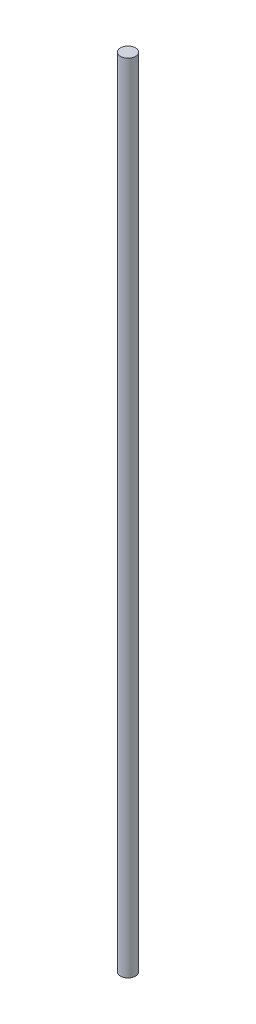
ISO-10303-21;
HEADER;
FILE_DESCRIPTION(('STEP AP214'),'2;1');
FILE_NAME('part.step','',(''),(''),'','','');
FILE_SCHEMA(('AUTOMOTIVE_DESIGN { 1 0 10303 214 1 1 1 1 }'));
ENDSEC;
DATA;
#1=APPLICATION_CONTEXT('core data for automotive mechanical design processes');
#2=APPLICATION_PROTOCOL_DEFINITION('international standard','automotive_design',2000,#1);
#3=PRODUCT_CONTEXT('',#1,'mechanical');
#4=PRODUCT('Part','Part','',(#3));
#5=PRODUCT_RELATED_PRODUCT_CATEGORY('part','',(#4));
#6=PRODUCT_DEFINITION_FORMATION('','',#4);
#7=PRODUCT_DEFINITION_CONTEXT('part definition',#1,'design');
#8=PRODUCT_DEFINITION('design','',#6,#7);
#9=PRODUCT_DEFINITION_SHAPE('','',#8);
#10=(LENGTH_UNIT() NAMED_UNIT(*) SI_UNIT(.MILLI.,.METRE.));
#11=(NAMED_UNIT(*) PLANE_ANGLE_UNIT() SI_UNIT($,.RADIAN.));
#12=(NAMED_UNIT(*) SI_UNIT($,.STERADIAN.) SOLID_ANGLE_UNIT());
#13=UNCERTAINTY_MEASURE_WITH_UNIT(LENGTH_MEASURE(1.E-05),#10,'distance_accuracy_value','');
#14=(GEOMETRIC_REPRESENTATION_CONTEXT(3) GLOBAL_UNCERTAINTY_ASSIGNED_CONTEXT((#13)) GLOBAL_UNIT_ASSIGNED_CONTEXT((#10,
#11,#12)) REPRESENTATION_CONTEXT('',''));
#15=CARTESIAN_POINT('',(0.,0.,0.));
#16=DIRECTION('',(0.,0.,1.));
#17=DIRECTION('',(1.,0.,0.));
#18=AXIS2_PLACEMENT_3D('',#15,#16,#17);
#19=CARTESIAN_POINT('',(0.,-254.,0.));
#20=DIRECTION('',(0.,1.,0.));
#21=DIRECTION('',(0.,0.,1.));
#22=AXIS2_PLACEMENT_3D('',#19,#20,#21);
#23=CYLINDRICAL_SURFACE('',#22,4.7625);
#24=CARTESIAN_POINT('',(0.,-254.,0.));
#25=DIRECTION('',(0.,1.,0.));
#26=DIRECTION('',(0.,0.,1.));
#27=AXIS2_PLACEMENT_3D('',#24,#25,#26);
#28=CIRCLE('',#27,4.7625);
#29=CARTESIAN_POINT('',(0.,-254.,4.7625));
#30=VERTEX_POINT('',#29);
#31=EDGE_CURVE('E10',#30,#30,#28,.T.);
#32=ORIENTED_EDGE('',*,*,#31,.T.);
#33=EDGE_LOOP('',(#32));
#34=FACE_BOUND('',#33,.T.);
#35=CARTESIAN_POINT('',(0.,254.,0.));
#36=DIRECTION('',(0.,1.,0.));
#37=DIRECTION('',(0.,0.,1.));
#38=AXIS2_PLACEMENT_3D('',#35,#36,#37);
#39=CIRCLE('',#38,4.7625);
#40=CARTESIAN_POINT('',(0.,254.,4.7625));
#41=VERTEX_POINT('',#40);
#42=EDGE_CURVE('E46',#41,#41,#39,.T.);
#43=ORIENTED_EDGE('',*,*,#42,.F.);
#44=EDGE_LOOP('',(#43));
#45=FACE_BOUND('',#44,.T.);
#46=ADVANCED_FACE('F43',(#34,#45),#23,.T.);
#47=CARTESIAN_POINT('',(0.,-254.,0.));
#48=DIRECTION('',(0.,1.,0.));
#49=DIRECTION('',(0.,0.,1.));
#50=AXIS2_PLACEMENT_3D('',#47,#48,#49);
#51=PLANE('',#50);
#52=ORIENTED_EDGE('',*,*,#31,.F.);
#53=EDGE_LOOP('',(#52));
#54=FACE_BOUND('',#53,.T.);
#55=ADVANCED_FACE('F60',(#54),#51,.F.);
#56=CARTESIAN_POINT('',(0.,254.,0.));
#57=DIRECTION('',(0.,1.,0.));
#58=DIRECTION('',(0.,0.,1.));
#59=AXIS2_PLACEMENT_3D('',#56,#57,#58);
#60=PLANE('',#59);
#61=ORIENTED_EDGE('',*,*,#42,.T.);
#62=EDGE_LOOP('',(#61));
#63=FACE_BOUND('',#62,.T.);
#64=ADVANCED_FACE('F57',(#63),#60,.T.);
#65=CLOSED_SHELL('',(#46,#55,#64));
#66=MANIFOLD_SOLID_BREP('B2',#65);
#67=ADVANCED_BREP_SHAPE_REPRESENTATION('',(#18,#66),#14);
#68=SHAPE_DEFINITION_REPRESENTATION(#9,#67);
ENDSEC;
END-ISO-10303-21;
